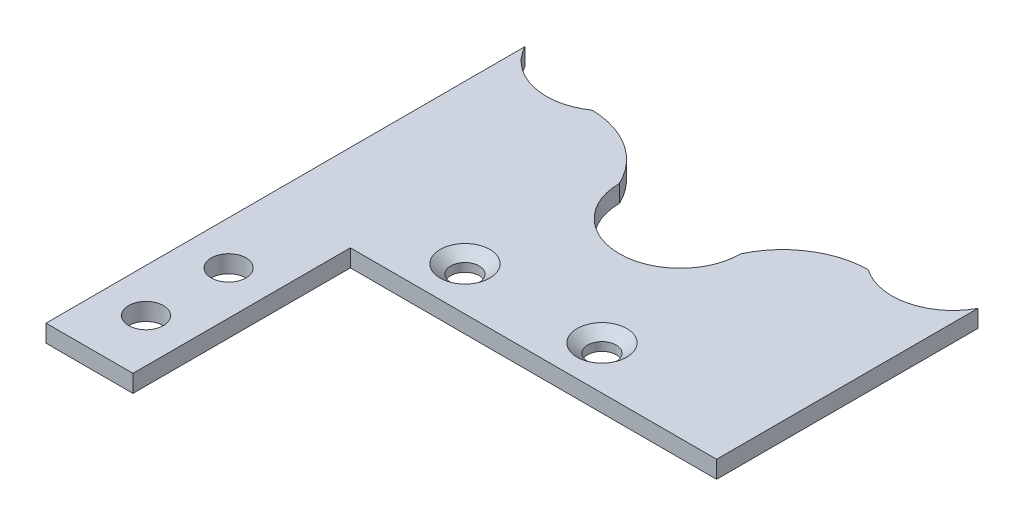
ISO-10303-21;
HEADER;
FILE_DESCRIPTION(('STEP AP214'),'2;1');
FILE_NAME('part.step','',(''),(''),'','','');
FILE_SCHEMA(('AUTOMOTIVE_DESIGN { 1 0 10303 214 1 1 1 1 }'));
ENDSEC;
DATA;
#1=APPLICATION_CONTEXT('core data for automotive mechanical design processes');
#2=APPLICATION_PROTOCOL_DEFINITION('international standard','automotive_design',2000,#1);
#3=PRODUCT_CONTEXT('',#1,'mechanical');
#4=PRODUCT('Part','Part','',(#3));
#5=PRODUCT_RELATED_PRODUCT_CATEGORY('part','',(#4));
#6=PRODUCT_DEFINITION_FORMATION('','',#4);
#7=PRODUCT_DEFINITION_CONTEXT('part definition',#1,'design');
#8=PRODUCT_DEFINITION('design','',#6,#7);
#9=PRODUCT_DEFINITION_SHAPE('','',#8);
#10=(LENGTH_UNIT() NAMED_UNIT(*) SI_UNIT(.MILLI.,.METRE.));
#11=(NAMED_UNIT(*) PLANE_ANGLE_UNIT() SI_UNIT($,.RADIAN.));
#12=(NAMED_UNIT(*) SI_UNIT($,.STERADIAN.) SOLID_ANGLE_UNIT());
#13=UNCERTAINTY_MEASURE_WITH_UNIT(LENGTH_MEASURE(1.E-05),#10,'distance_accuracy_value','');
#14=(GEOMETRIC_REPRESENTATION_CONTEXT(3) GLOBAL_UNCERTAINTY_ASSIGNED_CONTEXT((#13)) GLOBAL_UNIT_ASSIGNED_CONTEXT((#10,
#11,#12)) REPRESENTATION_CONTEXT('',''));
#15=CARTESIAN_POINT('',(0.,0.,0.));
#16=DIRECTION('',(0.,0.,1.));
#17=DIRECTION('',(1.,0.,0.));
#18=AXIS2_PLACEMENT_3D('',#15,#16,#17);
#19=CARTESIAN_POINT('',(16.0451571243017,-2.,4.26440295899608));
#20=DIRECTION('',(0.,1.,0.));
#21=DIRECTION('',(0.,0.,1.));
#22=AXIS2_PLACEMENT_3D('',#19,#20,#21);
#23=PLANE('',#22);
#24=CARTESIAN_POINT('',(-21.0555691185354,-2.,40.375));
#25=DIRECTION('',(0.,1.,0.));
#26=DIRECTION('',(0.,0.,1.));
#27=AXIS2_PLACEMENT_3D('',#24,#25,#26);
#28=CIRCLE('',#27,2.00000000000001);
#29=CARTESIAN_POINT('',(-21.0555691185354,-2.,42.375));
#30=VERTEX_POINT('',#29);
#31=EDGE_CURVE('E157',#30,#30,#28,.F.);
#32=ORIENTED_EDGE('',*,*,#31,.F.);
#33=EDGE_LOOP('',(#32));
#34=FACE_BOUND('',#33,.T.);
#35=CARTESIAN_POINT('',(-21.0555691185354,-2.,30.875));
#36=DIRECTION('',(0.,1.,0.));
#37=DIRECTION('',(0.,0.,1.));
#38=AXIS2_PLACEMENT_3D('',#35,#36,#37);
#39=CIRCLE('',#38,2.00000000000001);
#40=CARTESIAN_POINT('',(-21.0555691185354,-2.,32.875));
#41=VERTEX_POINT('',#40);
#42=EDGE_CURVE('E243',#41,#41,#39,.F.);
#43=ORIENTED_EDGE('',*,*,#42,.F.);
#44=EDGE_LOOP('',(#43));
#45=FACE_BOUND('',#44,.T.);
#46=CARTESIAN_POINT('',(16.0451571243017,-2.,4.26440295899608));
#47=DIRECTION('',(0.,1.,0.));
#48=DIRECTION('',(0.,0.,1.));
#49=AXIS2_PLACEMENT_3D('',#46,#47,#48);
#50=CIRCLE('',#49,10.);
#51=CARTESIAN_POINT('',(15.8700792263388,-2.,-5.73406431002295));
#52=VERTEX_POINT('',#51);
#53=CARTESIAN_POINT('',(7.,-2.,0.));
#54=VERTEX_POINT('',#53);
#55=EDGE_CURVE('E180',#52,#54,#50,.T.);
#56=ORIENTED_EDGE('',*,*,#55,.F.);
#57=CARTESIAN_POINT('',(19.8752830168529,-2.,-11.4749999999999));
#58=DIRECTION('',(0.,-1.,0.));
#59=DIRECTION('',(0.,0.,1.));
#60=AXIS2_PLACEMENT_3D('',#57,#58,#59);
#61=CIRCLE('',#60,7.);
#62=CARTESIAN_POINT('',(26.0555691185354,-2.,-8.18804644064582));
#63=VERTEX_POINT('',#62);
#64=EDGE_CURVE('E143',#63,#52,#61,.T.);
#65=ORIENTED_EDGE('',*,*,#64,.F.);
#66=DIRECTION('',(0.,0.,-1.));
#67=VECTOR('',#66,1.);
#68=CARTESIAN_POINT('',(26.0555691185354,-2.,-8.18804644064582));
#69=LINE('',#68,#67);
#70=CARTESIAN_POINT('',(26.0555691185354,-2.,21.875));
#71=VERTEX_POINT('',#70);
#72=EDGE_CURVE('E128',#71,#63,#69,.T.);
#73=ORIENTED_EDGE('',*,*,#72,.F.);
#74=DIRECTION('',(1.,0.,0.));
#75=VECTOR('',#74,1.);
#76=CARTESIAN_POINT('',(-16.0555691185354,-2.,21.875));
#77=LINE('',#76,#75);
#78=CARTESIAN_POINT('',(-16.0555691185354,-2.,21.875));
#79=VERTEX_POINT('',#78);
#80=EDGE_CURVE('E141',#79,#71,#77,.T.);
#81=ORIENTED_EDGE('',*,*,#80,.F.);
#82=DIRECTION('',(0.,0.,-1.));
#83=VECTOR('',#82,1.);
#84=CARTESIAN_POINT('',(-16.0555691185354,-2.,46.875));
#85=LINE('',#84,#83);
#86=CARTESIAN_POINT('',(-16.0555691185354,-2.,46.875));
#87=VERTEX_POINT('',#86);
#88=EDGE_CURVE('E146',#87,#79,#85,.T.);
#89=ORIENTED_EDGE('',*,*,#88,.F.);
#90=DIRECTION('',(1.,0.,0.));
#91=VECTOR('',#90,1.);
#92=CARTESIAN_POINT('',(-26.0555691185354,-2.,46.875));
#93=LINE('',#92,#91);
#94=CARTESIAN_POINT('',(-26.0555691185354,-2.,46.875));
#95=VERTEX_POINT('',#94);
#96=EDGE_CURVE('E148',#95,#87,#93,.T.);
#97=ORIENTED_EDGE('',*,*,#96,.F.);
#98=DIRECTION('',(0.,0.,1.));
#99=VECTOR('',#98,1.);
#100=CARTESIAN_POINT('',(-26.0555691185354,-2.,21.875));
#101=LINE('',#100,#99);
#102=CARTESIAN_POINT('',(-26.0555691185354,-2.,-8.18804644064587));
#103=VERTEX_POINT('',#102);
#104=EDGE_CURVE('E263',#103,#95,#101,.T.);
#105=ORIENTED_EDGE('',*,*,#104,.F.);
#106=CARTESIAN_POINT('',(-19.8752830168529,-2.,-11.4749999999999));
#107=DIRECTION('',(0.,-1.,0.));
#108=DIRECTION('',(0.,0.,-1.));
#109=AXIS2_PLACEMENT_3D('',#106,#107,#108);
#110=CIRCLE('',#109,7.);
#111=CARTESIAN_POINT('',(-15.8700792263388,-2.,-5.73406431002294));
#112=VERTEX_POINT('',#111);
#113=EDGE_CURVE('E260',#112,#103,#110,.T.);
#114=ORIENTED_EDGE('',*,*,#113,.F.);
#115=CARTESIAN_POINT('',(-16.0451571243017,-2.,4.26440295899608));
#116=DIRECTION('',(0.,1.,0.));
#117=DIRECTION('',(0.,0.,1.));
#118=AXIS2_PLACEMENT_3D('',#115,#116,#117);
#119=CIRCLE('',#118,9.99999999999999);
#120=CARTESIAN_POINT('',(-7.,-2.,0.));
#121=VERTEX_POINT('',#120);
#122=EDGE_CURVE('E257',#121,#112,#119,.T.);
#123=ORIENTED_EDGE('',*,*,#122,.F.);
#124=CARTESIAN_POINT('',(0.,-2.,0.));
#125=DIRECTION('',(0.,-1.,0.));
#126=DIRECTION('',(0.,0.,-1.));
#127=AXIS2_PLACEMENT_3D('',#124,#125,#126);
#128=CIRCLE('',#127,7.);
#129=EDGE_CURVE('E255',#54,#121,#128,.T.);
#130=ORIENTED_EDGE('',*,*,#129,.F.);
#131=EDGE_LOOP('',(#56,#65,#73,#81,#89,#97,#105,#114,#123,#130));
#132=FACE_BOUND('',#131,.T.);
#133=CARTESIAN_POINT('',(-7.87528301685294,-2.,16.875));
#134=DIRECTION('',(0.,1.,0.));
#135=DIRECTION('',(0.,0.,1.));
#136=AXIS2_PLACEMENT_3D('',#133,#134,#135);
#137=CIRCLE('',#136,1.63194999999999);
#138=CARTESIAN_POINT('',(-7.87528301685294,-2.,18.50695));
#139=VERTEX_POINT('',#138);
#140=EDGE_CURVE('E244',#139,#139,#137,.F.);
#141=ORIENTED_EDGE('',*,*,#140,.F.);
#142=EDGE_LOOP('',(#141));
#143=FACE_BOUND('',#142,.T.);
#144=CARTESIAN_POINT('',(7.87528301685294,-2.,16.875));
#145=DIRECTION('',(0.,1.,0.));
#146=DIRECTION('',(0.,0.,1.));
#147=AXIS2_PLACEMENT_3D('',#144,#145,#146);
#148=CIRCLE('',#147,1.63194999999999);
#149=CARTESIAN_POINT('',(7.87528301685294,-2.,18.50695));
#150=VERTEX_POINT('',#149);
#151=EDGE_CURVE('E407',#150,#150,#148,.F.);
#152=ORIENTED_EDGE('',*,*,#151,.F.);
#153=EDGE_LOOP('',(#152));
#154=FACE_BOUND('',#153,.T.);
#155=ADVANCED_FACE('F43',(#34,#45,#132,#143,#154),#23,.F.);
#156=CARTESIAN_POINT('',(16.0451571243017,-2.,4.26440295899608));
#157=DIRECTION('',(0.,1.,0.));
#158=DIRECTION('',(0.,0.,1.));
#159=AXIS2_PLACEMENT_3D('',#156,#157,#158);
#160=CYLINDRICAL_SURFACE('',#159,10.);
#161=CARTESIAN_POINT('',(16.0451571243017,0.,4.26440295899608));
#162=DIRECTION('',(0.,1.,0.));
#163=DIRECTION('',(0.,0.,1.));
#164=AXIS2_PLACEMENT_3D('',#161,#162,#163);
#165=CIRCLE('',#164,10.);
#166=CARTESIAN_POINT('',(15.8700792263388,0.,-5.73406431002295));
#167=VERTEX_POINT('',#166);
#168=CARTESIAN_POINT('',(7.,0.,0.));
#169=VERTEX_POINT('',#168);
#170=EDGE_CURVE('E153',#167,#169,#165,.T.);
#171=ORIENTED_EDGE('',*,*,#170,.F.);
#172=DIRECTION('',(0.,1.,0.));
#173=VECTOR('',#172,1.);
#174=CARTESIAN_POINT('',(15.8700792263388,-2.,-5.73406431002295));
#175=LINE('',#174,#173);
#176=EDGE_CURVE('E11',#52,#167,#175,.T.);
#177=ORIENTED_EDGE('',*,*,#176,.F.);
#178=ORIENTED_EDGE('',*,*,#55,.T.);
#179=DIRECTION('',(0.,1.,0.));
#180=VECTOR('',#179,1.);
#181=CARTESIAN_POINT('',(7.,-2.,0.));
#182=LINE('',#181,#180);
#183=EDGE_CURVE('E47',#54,#169,#182,.T.);
#184=ORIENTED_EDGE('',*,*,#183,.T.);
#185=EDGE_LOOP('',(#171,#177,#178,#184));
#186=FACE_BOUND('',#185,.T.);
#187=ADVANCED_FACE('F45',(#186),#160,.T.);
#188=CARTESIAN_POINT('',(19.8752830168529,-2.,-11.4749999999999));
#189=DIRECTION('',(0.,1.,0.));
#190=DIRECTION('',(0.,0.,1.));
#191=AXIS2_PLACEMENT_3D('',#188,#189,#190);
#192=CYLINDRICAL_SURFACE('',#191,7.);
#193=CARTESIAN_POINT('',(19.8752830168529,0.,-11.4749999999999));
#194=DIRECTION('',(0.,-1.,0.));
#195=DIRECTION('',(0.,0.,1.));
#196=AXIS2_PLACEMENT_3D('',#193,#194,#195);
#197=CIRCLE('',#196,7.);
#198=CARTESIAN_POINT('',(26.0555691185354,0.,-8.18804644064582));
#199=VERTEX_POINT('',#198);
#200=EDGE_CURVE('E178',#199,#167,#197,.T.);
#201=ORIENTED_EDGE('',*,*,#200,.F.);
#202=DIRECTION('',(0.,1.,0.));
#203=VECTOR('',#202,1.);
#204=CARTESIAN_POINT('',(26.0555691185354,-2.,-8.18804644064582));
#205=LINE('',#204,#203);
#206=EDGE_CURVE('E53',#63,#199,#205,.T.);
#207=ORIENTED_EDGE('',*,*,#206,.F.);
#208=ORIENTED_EDGE('',*,*,#64,.T.);
#209=ORIENTED_EDGE('',*,*,#176,.T.);
#210=EDGE_LOOP('',(#201,#207,#208,#209));
#211=FACE_BOUND('',#210,.T.);
#212=ADVANCED_FACE('F197',(#211),#192,.F.);
#213=CARTESIAN_POINT('',(26.0555691185354,-2.,-8.18804644064582));
#214=DIRECTION('',(1.,0.,0.));
#215=DIRECTION('',(0.,0.,-1.));
#216=AXIS2_PLACEMENT_3D('',#213,#214,#215);
#217=PLANE('',#216);
#218=DIRECTION('',(0.,0.,-1.));
#219=VECTOR('',#218,1.);
#220=CARTESIAN_POINT('',(26.0555691185354,0.,-8.18804644064582));
#221=LINE('',#220,#219);
#222=CARTESIAN_POINT('',(26.0555691185354,0.,21.875));
#223=VERTEX_POINT('',#222);
#224=EDGE_CURVE('E130',#223,#199,#221,.T.);
#225=ORIENTED_EDGE('',*,*,#224,.F.);
#226=DIRECTION('',(0.,1.,0.));
#227=VECTOR('',#226,1.);
#228=CARTESIAN_POINT('',(26.0555691185354,-2.,21.875));
#229=LINE('',#228,#227);
#230=EDGE_CURVE('E125',#71,#223,#229,.T.);
#231=ORIENTED_EDGE('',*,*,#230,.F.);
#232=ORIENTED_EDGE('',*,*,#72,.T.);
#233=ORIENTED_EDGE('',*,*,#206,.T.);
#234=EDGE_LOOP('',(#225,#231,#232,#233));
#235=FACE_BOUND('',#234,.T.);
#236=ADVANCED_FACE('F127',(#235),#217,.T.);
#237=CARTESIAN_POINT('',(-16.0555691185354,-2.,21.875));
#238=DIRECTION('',(0.,0.,1.));
#239=DIRECTION('',(1.,0.,0.));
#240=AXIS2_PLACEMENT_3D('',#237,#238,#239);
#241=PLANE('',#240);
#242=DIRECTION('',(1.,0.,0.));
#243=VECTOR('',#242,1.);
#244=CARTESIAN_POINT('',(-16.0555691185354,0.,21.875));
#245=LINE('',#244,#243);
#246=CARTESIAN_POINT('',(-16.0555691185354,0.,21.875));
#247=VERTEX_POINT('',#246);
#248=EDGE_CURVE('E175',#247,#223,#245,.T.);
#249=ORIENTED_EDGE('',*,*,#248,.F.);
#250=DIRECTION('',(0.,1.,0.));
#251=VECTOR('',#250,1.);
#252=CARTESIAN_POINT('',(-16.0555691185354,-2.,21.875));
#253=LINE('',#252,#251);
#254=EDGE_CURVE('E135',#79,#247,#253,.T.);
#255=ORIENTED_EDGE('',*,*,#254,.F.);
#256=ORIENTED_EDGE('',*,*,#80,.T.);
#257=ORIENTED_EDGE('',*,*,#230,.T.);
#258=EDGE_LOOP('',(#249,#255,#256,#257));
#259=FACE_BOUND('',#258,.T.);
#260=ADVANCED_FACE('F145',(#259),#241,.T.);
#261=CARTESIAN_POINT('',(-16.0555691185354,-2.,46.875));
#262=DIRECTION('',(1.,0.,0.));
#263=DIRECTION('',(0.,0.,-1.));
#264=AXIS2_PLACEMENT_3D('',#261,#262,#263);
#265=PLANE('',#264);
#266=DIRECTION('',(0.,0.,-1.));
#267=VECTOR('',#266,1.);
#268=CARTESIAN_POINT('',(-16.0555691185354,0.,46.875));
#269=LINE('',#268,#267);
#270=CARTESIAN_POINT('',(-16.0555691185354,0.,46.875));
#271=VERTEX_POINT('',#270);
#272=EDGE_CURVE('E172',#271,#247,#269,.T.);
#273=ORIENTED_EDGE('',*,*,#272,.F.);
#274=DIRECTION('',(0.,1.,0.));
#275=VECTOR('',#274,1.);
#276=CARTESIAN_POINT('',(-16.0555691185354,-2.,46.875));
#277=LINE('',#276,#275);
#278=EDGE_CURVE('E184',#87,#271,#277,.T.);
#279=ORIENTED_EDGE('',*,*,#278,.F.);
#280=ORIENTED_EDGE('',*,*,#88,.T.);
#281=ORIENTED_EDGE('',*,*,#254,.T.);
#282=EDGE_LOOP('',(#273,#279,#280,#281));
#283=FACE_BOUND('',#282,.T.);
#284=ADVANCED_FACE('F274',(#283),#265,.T.);
#285=CARTESIAN_POINT('',(-26.0555691185354,-2.,46.875));
#286=DIRECTION('',(0.,0.,1.));
#287=DIRECTION('',(1.,0.,0.));
#288=AXIS2_PLACEMENT_3D('',#285,#286,#287);
#289=PLANE('',#288);
#290=DIRECTION('',(1.,0.,0.));
#291=VECTOR('',#290,1.);
#292=CARTESIAN_POINT('',(-26.0555691185354,0.,46.875));
#293=LINE('',#292,#291);
#294=CARTESIAN_POINT('',(-26.0555691185354,0.,46.875));
#295=VERTEX_POINT('',#294);
#296=EDGE_CURVE('E169',#295,#271,#293,.T.);
#297=ORIENTED_EDGE('',*,*,#296,.F.);
#298=DIRECTION('',(0.,1.,0.));
#299=VECTOR('',#298,1.);
#300=CARTESIAN_POINT('',(-26.0555691185354,-2.,46.875));
#301=LINE('',#300,#299);
#302=EDGE_CURVE('E186',#95,#295,#301,.T.);
#303=ORIENTED_EDGE('',*,*,#302,.F.);
#304=ORIENTED_EDGE('',*,*,#96,.T.);
#305=ORIENTED_EDGE('',*,*,#278,.T.);
#306=EDGE_LOOP('',(#297,#303,#304,#305));
#307=FACE_BOUND('',#306,.T.);
#308=ADVANCED_FACE('F269',(#307),#289,.T.);
#309=CARTESIAN_POINT('',(-26.0555691185354,-2.,21.875));
#310=DIRECTION('',(-1.,0.,0.));
#311=DIRECTION('',(0.,0.,1.));
#312=AXIS2_PLACEMENT_3D('',#309,#310,#311);
#313=PLANE('',#312);
#314=DIRECTION('',(0.,0.,1.));
#315=VECTOR('',#314,1.);
#316=CARTESIAN_POINT('',(-26.0555691185354,0.,21.875));
#317=LINE('',#316,#315);
#318=CARTESIAN_POINT('',(-26.0555691185354,0.,-8.18804644064587));
#319=VERTEX_POINT('',#318);
#320=EDGE_CURVE('E166',#319,#295,#317,.T.);
#321=ORIENTED_EDGE('',*,*,#320,.F.);
#322=DIRECTION('',(0.,1.,0.));
#323=VECTOR('',#322,1.);
#324=CARTESIAN_POINT('',(-26.0555691185354,-2.,-8.18804644064587));
#325=LINE('',#324,#323);
#326=EDGE_CURVE('E188',#103,#319,#325,.T.);
#327=ORIENTED_EDGE('',*,*,#326,.F.);
#328=ORIENTED_EDGE('',*,*,#104,.T.);
#329=ORIENTED_EDGE('',*,*,#302,.T.);
#330=EDGE_LOOP('',(#321,#327,#328,#329));
#331=FACE_BOUND('',#330,.T.);
#332=ADVANCED_FACE('F277',(#331),#313,.T.);
#333=CARTESIAN_POINT('',(-19.8752830168529,-2.,-11.4749999999999));
#334=DIRECTION('',(0.,1.,0.));
#335=DIRECTION('',(0.,0.,1.));
#336=AXIS2_PLACEMENT_3D('',#333,#334,#335);
#337=CYLINDRICAL_SURFACE('',#336,7.);
#338=CARTESIAN_POINT('',(-19.8752830168529,0.,-11.4749999999999));
#339=DIRECTION('',(0.,-1.,0.));
#340=DIRECTION('',(0.,0.,-1.));
#341=AXIS2_PLACEMENT_3D('',#338,#339,#340);
#342=CIRCLE('',#341,7.);
#343=CARTESIAN_POINT('',(-15.8700792263388,0.,-5.73406431002294));
#344=VERTEX_POINT('',#343);
#345=EDGE_CURVE('E163',#344,#319,#342,.T.);
#346=ORIENTED_EDGE('',*,*,#345,.F.);
#347=DIRECTION('',(0.,1.,0.));
#348=VECTOR('',#347,1.);
#349=CARTESIAN_POINT('',(-15.8700792263388,-2.,-5.73406431002294));
#350=LINE('',#349,#348);
#351=EDGE_CURVE('E191',#112,#344,#350,.T.);
#352=ORIENTED_EDGE('',*,*,#351,.F.);
#353=ORIENTED_EDGE('',*,*,#113,.T.);
#354=ORIENTED_EDGE('',*,*,#326,.T.);
#355=EDGE_LOOP('',(#346,#352,#353,#354));
#356=FACE_BOUND('',#355,.T.);
#357=ADVANCED_FACE('F279',(#356),#337,.F.);
#358=CARTESIAN_POINT('',(-16.0451571243017,-2.,4.26440295899608));
#359=DIRECTION('',(0.,1.,0.));
#360=DIRECTION('',(0.,0.,1.));
#361=AXIS2_PLACEMENT_3D('',#358,#359,#360);
#362=CYLINDRICAL_SURFACE('',#361,9.99999999999999);
#363=CARTESIAN_POINT('',(-16.0451571243017,0.,4.26440295899608));
#364=DIRECTION('',(0.,1.,0.));
#365=DIRECTION('',(0.,0.,1.));
#366=AXIS2_PLACEMENT_3D('',#363,#364,#365);
#367=CIRCLE('',#366,9.99999999999999);
#368=CARTESIAN_POINT('',(-7.,0.,0.));
#369=VERTEX_POINT('',#368);
#370=EDGE_CURVE('E160',#369,#344,#367,.T.);
#371=ORIENTED_EDGE('',*,*,#370,.F.);
#372=DIRECTION('',(0.,1.,0.));
#373=VECTOR('',#372,1.);
#374=CARTESIAN_POINT('',(-7.,-2.,0.));
#375=LINE('',#374,#373);
#376=EDGE_CURVE('E192',#121,#369,#375,.T.);
#377=ORIENTED_EDGE('',*,*,#376,.F.);
#378=ORIENTED_EDGE('',*,*,#122,.T.);
#379=ORIENTED_EDGE('',*,*,#351,.T.);
#380=EDGE_LOOP('',(#371,#377,#378,#379));
#381=FACE_BOUND('',#380,.T.);
#382=ADVANCED_FACE('F226',(#381),#362,.T.);
#383=CARTESIAN_POINT('',(0.,-2.,0.));
#384=DIRECTION('',(0.,1.,0.));
#385=DIRECTION('',(0.,0.,1.));
#386=AXIS2_PLACEMENT_3D('',#383,#384,#385);
#387=CYLINDRICAL_SURFACE('',#386,7.);
#388=CARTESIAN_POINT('',(0.,0.,0.));
#389=DIRECTION('',(0.,-1.,0.));
#390=DIRECTION('',(0.,0.,-1.));
#391=AXIS2_PLACEMENT_3D('',#388,#389,#390);
#392=CIRCLE('',#391,7.);
#393=EDGE_CURVE('E156',#169,#369,#392,.T.);
#394=ORIENTED_EDGE('',*,*,#393,.F.);
#395=ORIENTED_EDGE('',*,*,#183,.F.);
#396=ORIENTED_EDGE('',*,*,#129,.T.);
#397=ORIENTED_EDGE('',*,*,#376,.T.);
#398=EDGE_LOOP('',(#394,#395,#396,#397));
#399=FACE_BOUND('',#398,.T.);
#400=ADVANCED_FACE('F194',(#399),#387,.F.);
#401=CARTESIAN_POINT('',(16.0451571243017,0.,4.26440295899608));
#402=DIRECTION('',(0.,1.,0.));
#403=DIRECTION('',(0.,0.,1.));
#404=AXIS2_PLACEMENT_3D('',#401,#402,#403);
#405=PLANE('',#404);
#406=CARTESIAN_POINT('',(7.87528301685294,0.,16.875));
#407=DIRECTION('',(0.,1.,0.));
#408=DIRECTION('',(0.,0.,1.));
#409=AXIS2_PLACEMENT_3D('',#406,#407,#408);
#410=CIRCLE('',#409,2.8575);
#411=CARTESIAN_POINT('',(7.87528301685294,0.,19.7325));
#412=VERTEX_POINT('',#411);
#413=EDGE_CURVE('E230',#412,#412,#410,.T.);
#414=ORIENTED_EDGE('',*,*,#413,.F.);
#415=EDGE_LOOP('',(#414));
#416=FACE_BOUND('',#415,.T.);
#417=CARTESIAN_POINT('',(-7.87528301685294,0.,16.875));
#418=DIRECTION('',(0.,1.,0.));
#419=DIRECTION('',(0.,0.,1.));
#420=AXIS2_PLACEMENT_3D('',#417,#418,#419);
#421=CIRCLE('',#420,2.8575);
#422=CARTESIAN_POINT('',(-7.87528301685294,0.,19.7325));
#423=VERTEX_POINT('',#422);
#424=EDGE_CURVE('E234',#423,#423,#421,.T.);
#425=ORIENTED_EDGE('',*,*,#424,.F.);
#426=EDGE_LOOP('',(#425));
#427=FACE_BOUND('',#426,.T.);
#428=CARTESIAN_POINT('',(-21.0555691185354,0.,40.375));
#429=DIRECTION('',(0.,1.,0.));
#430=DIRECTION('',(0.,0.,1.));
#431=AXIS2_PLACEMENT_3D('',#428,#429,#430);
#432=CIRCLE('',#431,2.00000000000001);
#433=CARTESIAN_POINT('',(-21.0555691185354,0.,42.375));
#434=VERTEX_POINT('',#433);
#435=EDGE_CURVE('E238',#434,#434,#432,.T.);
#436=ORIENTED_EDGE('',*,*,#435,.F.);
#437=EDGE_LOOP('',(#436));
#438=FACE_BOUND('',#437,.T.);
#439=CARTESIAN_POINT('',(-21.0555691185354,0.,30.875));
#440=DIRECTION('',(0.,1.,0.));
#441=DIRECTION('',(0.,0.,1.));
#442=AXIS2_PLACEMENT_3D('',#439,#440,#441);
#443=CIRCLE('',#442,2.00000000000001);
#444=CARTESIAN_POINT('',(-21.0555691185354,0.,32.875));
#445=VERTEX_POINT('',#444);
#446=EDGE_CURVE('E241',#445,#445,#443,.T.);
#447=ORIENTED_EDGE('',*,*,#446,.F.);
#448=EDGE_LOOP('',(#447));
#449=FACE_BOUND('',#448,.T.);
#450=ORIENTED_EDGE('',*,*,#170,.T.);
#451=ORIENTED_EDGE('',*,*,#393,.T.);
#452=ORIENTED_EDGE('',*,*,#370,.T.);
#453=ORIENTED_EDGE('',*,*,#345,.T.);
#454=ORIENTED_EDGE('',*,*,#320,.T.);
#455=ORIENTED_EDGE('',*,*,#296,.T.);
#456=ORIENTED_EDGE('',*,*,#272,.T.);
#457=ORIENTED_EDGE('',*,*,#248,.T.);
#458=ORIENTED_EDGE('',*,*,#224,.T.);
#459=ORIENTED_EDGE('',*,*,#200,.T.);
#460=EDGE_LOOP('',(#450,#451,#452,#453,#454,#455,#456,#457,#458,#459));
#461=FACE_BOUND('',#460,.T.);
#462=ADVANCED_FACE('F196',(#416,#427,#438,#449,#461),#405,.T.);
#463=CARTESIAN_POINT('',(-21.0555691185354,-7.6568542494924,30.875));
#464=DIRECTION('',(0.,1.,0.));
#465=DIRECTION('',(0.,0.,1.));
#466=AXIS2_PLACEMENT_3D('',#463,#464,#465);
#467=CYLINDRICAL_SURFACE('',#466,2.00000000000001);
#468=ORIENTED_EDGE('',*,*,#42,.T.);
#469=EDGE_LOOP('',(#468));
#470=FACE_BOUND('',#469,.T.);
#471=ORIENTED_EDGE('',*,*,#446,.T.);
#472=EDGE_LOOP('',(#471));
#473=FACE_BOUND('',#472,.T.);
#474=ADVANCED_FACE('F216',(#470,#473),#467,.F.);
#475=CARTESIAN_POINT('',(-21.0555691185354,-7.6568542494924,40.375));
#476=DIRECTION('',(0.,1.,0.));
#477=DIRECTION('',(0.,0.,1.));
#478=AXIS2_PLACEMENT_3D('',#475,#476,#477);
#479=CYLINDRICAL_SURFACE('',#478,2.00000000000001);
#480=ORIENTED_EDGE('',*,*,#31,.T.);
#481=EDGE_LOOP('',(#480));
#482=FACE_BOUND('',#481,.T.);
#483=ORIENTED_EDGE('',*,*,#435,.T.);
#484=EDGE_LOOP('',(#483));
#485=FACE_BOUND('',#484,.T.);
#486=ADVANCED_FACE('F223',(#482,#485),#479,.F.);
#487=CARTESIAN_POINT('',(-7.87528301685294,0.,16.875));
#488=DIRECTION('',(0.,1.,0.));
#489=DIRECTION('',(0.,0.,1.));
#490=AXIS2_PLACEMENT_3D('',#487,#488,#489);
#491=CYLINDRICAL_SURFACE('',#490,1.63194999999999);
#492=ORIENTED_EDGE('',*,*,#140,.T.);
#493=EDGE_LOOP('',(#492));
#494=FACE_BOUND('',#493,.T.);
#495=CARTESIAN_POINT('',(-7.87528301685294,-1.02835855298933,16.875));
#496=DIRECTION('',(0.,1.,0.));
#497=DIRECTION('',(0.,0.,1.));
#498=AXIS2_PLACEMENT_3D('',#495,#496,#497);
#499=CIRCLE('',#498,1.63194999999999);
#500=CARTESIAN_POINT('',(-7.87528301685294,-1.02835855298933,18.50695));
#501=VERTEX_POINT('',#500);
#502=EDGE_CURVE('E249',#501,#501,#499,.T.);
#503=ORIENTED_EDGE('',*,*,#502,.T.);
#504=EDGE_LOOP('',(#503));
#505=FACE_BOUND('',#504,.T.);
#506=ADVANCED_FACE('F354',(#494,#505),#491,.F.);
#507=CARTESIAN_POINT('',(-7.87528301685294,0.,16.875));
#508=DIRECTION('',(0.,1.,0.));
#509=DIRECTION('',(0.,0.,1.));
#510=AXIS2_PLACEMENT_3D('',#507,#508,#509);
#511=CONICAL_SURFACE('',#510,2.8575,0.872664625997162);
#512=ORIENTED_EDGE('',*,*,#502,.F.);
#513=EDGE_LOOP('',(#512));
#514=FACE_BOUND('',#513,.T.);
#515=ORIENTED_EDGE('',*,*,#424,.T.);
#516=EDGE_LOOP('',(#515));
#517=FACE_BOUND('',#516,.T.);
#518=ADVANCED_FACE('F369',(#514,#517),#511,.F.);
#519=CARTESIAN_POINT('',(7.87528301685294,0.,16.875));
#520=DIRECTION('',(0.,1.,0.));
#521=DIRECTION('',(0.,0.,1.));
#522=AXIS2_PLACEMENT_3D('',#519,#520,#521);
#523=CYLINDRICAL_SURFACE('',#522,1.63194999999999);
#524=ORIENTED_EDGE('',*,*,#151,.T.);
#525=EDGE_LOOP('',(#524));
#526=FACE_BOUND('',#525,.T.);
#527=CARTESIAN_POINT('',(7.87528301685294,-1.02835855298933,16.875));
#528=DIRECTION('',(0.,1.,0.));
#529=DIRECTION('',(0.,0.,1.));
#530=AXIS2_PLACEMENT_3D('',#527,#528,#529);
#531=CIRCLE('',#530,1.63194999999999);
#532=CARTESIAN_POINT('',(7.87528301685294,-1.02835855298933,18.50695));
#533=VERTEX_POINT('',#532);
#534=EDGE_CURVE('E405',#533,#533,#531,.T.);
#535=ORIENTED_EDGE('',*,*,#534,.T.);
#536=EDGE_LOOP('',(#535));
#537=FACE_BOUND('',#536,.T.);
#538=ADVANCED_FACE('F379',(#526,#537),#523,.F.);
#539=CARTESIAN_POINT('',(7.87528301685294,0.,16.875));
#540=DIRECTION('',(0.,1.,0.));
#541=DIRECTION('',(0.,0.,1.));
#542=AXIS2_PLACEMENT_3D('',#539,#540,#541);
#543=CONICAL_SURFACE('',#542,2.8575,0.872664625997162);
#544=ORIENTED_EDGE('',*,*,#534,.F.);
#545=EDGE_LOOP('',(#544));
#546=FACE_BOUND('',#545,.T.);
#547=ORIENTED_EDGE('',*,*,#413,.T.);
#548=EDGE_LOOP('',(#547));
#549=FACE_BOUND('',#548,.T.);
#550=ADVANCED_FACE('F389',(#546,#549),#543,.F.);
#551=CLOSED_SHELL('',(#155,#187,#212,#236,#260,#284,#308,#332,#357,#382,#400,#462,#474,#486,
#506,#518,#538,#550));
#552=MANIFOLD_SOLID_BREP('B2',#551);
#553=ADVANCED_BREP_SHAPE_REPRESENTATION('',(#18,#552),#14);
#554=SHAPE_DEFINITION_REPRESENTATION(#9,#553);
ENDSEC;
END-ISO-10303-21;
